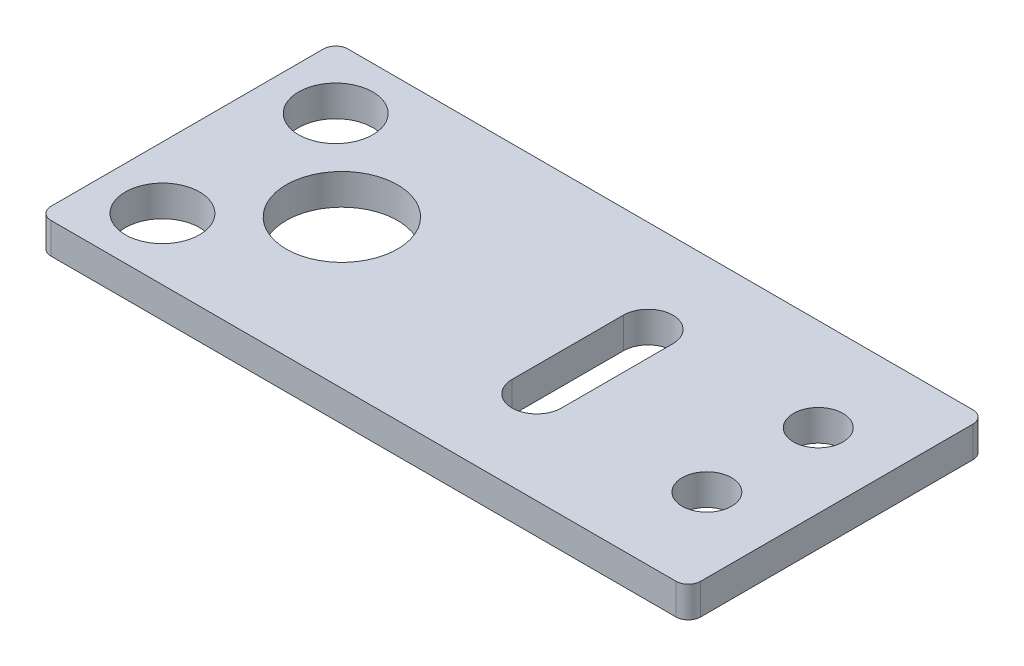
ISO-10303-21;
HEADER;
FILE_DESCRIPTION(('STEP AP214'),'2;1');
FILE_NAME('part.step','',(''),(''),'','','');
FILE_SCHEMA(('AUTOMOTIVE_DESIGN { 1 0 10303 214 1 1 1 1 }'));
ENDSEC;
DATA;
#1=APPLICATION_CONTEXT('core data for automotive mechanical design processes');
#2=APPLICATION_PROTOCOL_DEFINITION('international standard','automotive_design',2000,#1);
#3=PRODUCT_CONTEXT('',#1,'mechanical');
#4=PRODUCT('Part','Part','',(#3));
#5=PRODUCT_RELATED_PRODUCT_CATEGORY('part','',(#4));
#6=PRODUCT_DEFINITION_FORMATION('','',#4);
#7=PRODUCT_DEFINITION_CONTEXT('part definition',#1,'design');
#8=PRODUCT_DEFINITION('design','',#6,#7);
#9=PRODUCT_DEFINITION_SHAPE('','',#8);
#10=(LENGTH_UNIT() NAMED_UNIT(*) SI_UNIT(.MILLI.,.METRE.));
#11=(NAMED_UNIT(*) PLANE_ANGLE_UNIT() SI_UNIT($,.RADIAN.));
#12=(NAMED_UNIT(*) SI_UNIT($,.STERADIAN.) SOLID_ANGLE_UNIT());
#13=UNCERTAINTY_MEASURE_WITH_UNIT(LENGTH_MEASURE(1.E-05),#10,'distance_accuracy_value','');
#14=(GEOMETRIC_REPRESENTATION_CONTEXT(3) GLOBAL_UNCERTAINTY_ASSIGNED_CONTEXT((#13)) GLOBAL_UNIT_ASSIGNED_CONTEXT((#10,
#11,#12)) REPRESENTATION_CONTEXT('',''));
#15=CARTESIAN_POINT('',(0.,0.,0.));
#16=DIRECTION('',(0.,0.,1.));
#17=DIRECTION('',(1.,0.,0.));
#18=AXIS2_PLACEMENT_3D('',#15,#16,#17);
#19=CARTESIAN_POINT('',(0.,5.,0.));
#20=DIRECTION('',(0.,-1.,0.));
#21=DIRECTION('',(0.,0.,-1.));
#22=AXIS2_PLACEMENT_3D('',#19,#20,#21);
#23=PLANE('',#22);
#24=DIRECTION('',(0.,0.,-1.));
#25=VECTOR('',#24,1.);
#26=CARTESIAN_POINT('',(105.,5.,-48.));
#27=LINE('',#26,#25);
#28=CARTESIAN_POINT('',(105.,5.,-2.));
#29=VERTEX_POINT('',#28);
#30=CARTESIAN_POINT('',(105.,5.,-46.));
#31=VERTEX_POINT('',#30);
#32=EDGE_CURVE('E173',#29,#31,#27,.T.);
#33=ORIENTED_EDGE('',*,*,#32,.T.);
#34=CARTESIAN_POINT('',(103.,5.,-46.));
#35=DIRECTION('',(0.,-1.,0.));
#36=DIRECTION('',(0.,0.,-1.));
#37=AXIS2_PLACEMENT_3D('',#34,#35,#36);
#38=CIRCLE('',#37,2.);
#39=CARTESIAN_POINT('',(103.,5.,-48.));
#40=VERTEX_POINT('',#39);
#41=EDGE_CURVE('E211',#31,#40,#38,.F.);
#42=ORIENTED_EDGE('',*,*,#41,.T.);
#43=DIRECTION('',(-1.,0.,0.));
#44=VECTOR('',#43,1.);
#45=CARTESIAN_POINT('',(0.,5.,-48.));
#46=LINE('',#45,#44);
#47=CARTESIAN_POINT('',(2.,5.,-48.));
#48=VERTEX_POINT('',#47);
#49=EDGE_CURVE('E176',#40,#48,#46,.T.);
#50=ORIENTED_EDGE('',*,*,#49,.T.);
#51=CARTESIAN_POINT('',(2.,5.,-46.));
#52=DIRECTION('',(0.,-1.,0.));
#53=DIRECTION('',(0.,0.,-1.));
#54=AXIS2_PLACEMENT_3D('',#51,#52,#53);
#55=CIRCLE('',#54,2.);
#56=CARTESIAN_POINT('',(0.,5.,-46.));
#57=VERTEX_POINT('',#56);
#58=EDGE_CURVE('E206',#48,#57,#55,.F.);
#59=ORIENTED_EDGE('',*,*,#58,.T.);
#60=DIRECTION('',(0.,0.,1.));
#61=VECTOR('',#60,1.);
#62=CARTESIAN_POINT('',(0.,5.,0.));
#63=LINE('',#62,#61);
#64=CARTESIAN_POINT('',(0.,5.,-2.));
#65=VERTEX_POINT('',#64);
#66=EDGE_CURVE('E168',#57,#65,#63,.T.);
#67=ORIENTED_EDGE('',*,*,#66,.T.);
#68=CARTESIAN_POINT('',(2.,5.,-2.));
#69=DIRECTION('',(0.,-1.,0.));
#70=DIRECTION('',(0.,0.,-1.));
#71=AXIS2_PLACEMENT_3D('',#68,#69,#70);
#72=CIRCLE('',#71,2.);
#73=CARTESIAN_POINT('',(2.,5.,0.));
#74=VERTEX_POINT('',#73);
#75=EDGE_CURVE('E55',#65,#74,#72,.F.);
#76=ORIENTED_EDGE('',*,*,#75,.T.);
#77=DIRECTION('',(1.,0.,0.));
#78=VECTOR('',#77,1.);
#79=CARTESIAN_POINT('',(0.,5.,0.));
#80=LINE('',#79,#78);
#81=CARTESIAN_POINT('',(103.,5.,0.));
#82=VERTEX_POINT('',#81);
#83=EDGE_CURVE('E170',#74,#82,#80,.T.);
#84=ORIENTED_EDGE('',*,*,#83,.T.);
#85=CARTESIAN_POINT('',(103.,5.,-2.));
#86=DIRECTION('',(0.,-1.,0.));
#87=DIRECTION('',(0.,0.,-1.));
#88=AXIS2_PLACEMENT_3D('',#85,#86,#87);
#89=CIRCLE('',#88,2.);
#90=EDGE_CURVE('E209',#82,#29,#89,.F.);
#91=ORIENTED_EDGE('',*,*,#90,.T.);
#92=EDGE_LOOP('',(#33,#42,#50,#59,#67,#76,#84,#91));
#93=FACE_BOUND('',#92,.T.);
#94=CARTESIAN_POINT('',(65.5,5.,-33.));
#95=DIRECTION('',(0.,1.,0.));
#96=DIRECTION('',(0.,0.,1.));
#97=AXIS2_PLACEMENT_3D('',#94,#95,#96);
#98=CIRCLE('',#97,4.);
#99=CARTESIAN_POINT('',(69.5,5.,-33.));
#100=VERTEX_POINT('',#99);
#101=CARTESIAN_POINT('',(61.5,5.,-33.));
#102=VERTEX_POINT('',#101);
#103=EDGE_CURVE('E124',#100,#102,#98,.T.);
#104=ORIENTED_EDGE('',*,*,#103,.F.);
#105=DIRECTION('',(0.,0.,-1.));
#106=VECTOR('',#105,1.);
#107=CARTESIAN_POINT('',(69.5,5.,-33.));
#108=LINE('',#107,#106);
#109=CARTESIAN_POINT('',(69.5,5.,-15.));
#110=VERTEX_POINT('',#109);
#111=EDGE_CURVE('E150',#110,#100,#108,.T.);
#112=ORIENTED_EDGE('',*,*,#111,.F.);
#113=CARTESIAN_POINT('',(65.5,5.,-15.));
#114=DIRECTION('',(0.,1.,0.));
#115=DIRECTION('',(0.,0.,1.));
#116=AXIS2_PLACEMENT_3D('',#113,#114,#115);
#117=CIRCLE('',#116,4.);
#118=CARTESIAN_POINT('',(61.5,5.,-15.));
#119=VERTEX_POINT('',#118);
#120=EDGE_CURVE('E148',#119,#110,#117,.T.);
#121=ORIENTED_EDGE('',*,*,#120,.F.);
#122=DIRECTION('',(0.,0.,1.));
#123=VECTOR('',#122,1.);
#124=CARTESIAN_POINT('',(61.5,5.,-33.));
#125=LINE('',#124,#123);
#126=EDGE_CURVE('E134',#102,#119,#125,.T.);
#127=ORIENTED_EDGE('',*,*,#126,.F.);
#128=EDGE_LOOP('',(#104,#112,#121,#127));
#129=FACE_BOUND('',#128,.T.);
#130=CARTESIAN_POINT('',(10.,5.,-10.));
#131=DIRECTION('',(0.,1.,0.));
#132=DIRECTION('',(0.,0.,1.));
#133=AXIS2_PLACEMENT_3D('',#130,#131,#132);
#134=CIRCLE('',#133,6.);
#135=CARTESIAN_POINT('',(10.,5.,-4.));
#136=VERTEX_POINT('',#135);
#137=EDGE_CURVE('E157',#136,#136,#134,.T.);
#138=ORIENTED_EDGE('',*,*,#137,.F.);
#139=EDGE_LOOP('',(#138));
#140=FACE_BOUND('',#139,.T.);
#141=CARTESIAN_POINT('',(10.,5.,-38.));
#142=DIRECTION('',(0.,1.,0.));
#143=DIRECTION('',(0.,0.,1.));
#144=AXIS2_PLACEMENT_3D('',#141,#142,#143);
#145=CIRCLE('',#144,6.);
#146=CARTESIAN_POINT('',(10.,5.,-32.));
#147=VERTEX_POINT('',#146);
#148=EDGE_CURVE('E425',#147,#147,#145,.T.);
#149=ORIENTED_EDGE('',*,*,#148,.F.);
#150=EDGE_LOOP('',(#149));
#151=FACE_BOUND('',#150,.T.);
#152=CARTESIAN_POINT('',(25.,5.,-24.));
#153=DIRECTION('',(0.,1.,0.));
#154=DIRECTION('',(0.,0.,1.));
#155=AXIS2_PLACEMENT_3D('',#152,#153,#154);
#156=CIRCLE('',#155,9.);
#157=CARTESIAN_POINT('',(25.,5.,-15.));
#158=VERTEX_POINT('',#157);
#159=EDGE_CURVE('E432',#158,#158,#156,.T.);
#160=ORIENTED_EDGE('',*,*,#159,.F.);
#161=EDGE_LOOP('',(#160));
#162=FACE_BOUND('',#161,.T.);
#163=CARTESIAN_POINT('',(93.,5.,-15.));
#164=DIRECTION('',(0.,1.,0.));
#165=DIRECTION('',(0.,0.,1.));
#166=AXIS2_PLACEMENT_3D('',#163,#164,#165);
#167=CIRCLE('',#166,4.00000000000001);
#168=CARTESIAN_POINT('',(93.,5.,-11.));
#169=VERTEX_POINT('',#168);
#170=EDGE_CURVE('E437',#169,#169,#167,.T.);
#171=ORIENTED_EDGE('',*,*,#170,.F.);
#172=EDGE_LOOP('',(#171));
#173=FACE_BOUND('',#172,.T.);
#174=CARTESIAN_POINT('',(93.,5.,-33.));
#175=DIRECTION('',(0.,1.,0.));
#176=DIRECTION('',(0.,0.,1.));
#177=AXIS2_PLACEMENT_3D('',#174,#175,#176);
#178=CIRCLE('',#177,4.00000000000001);
#179=CARTESIAN_POINT('',(93.,5.,-29.));
#180=VERTEX_POINT('',#179);
#181=EDGE_CURVE('E443',#180,#180,#178,.T.);
#182=ORIENTED_EDGE('',*,*,#181,.F.);
#183=EDGE_LOOP('',(#182));
#184=FACE_BOUND('',#183,.T.);
#185=ADVANCED_FACE('F33',(#93,#129,#140,#151,#162,#173,#184),#23,.F.);
#186=CARTESIAN_POINT('',(0.,0.,0.));
#187=DIRECTION('',(0.,-1.,0.));
#188=DIRECTION('',(0.,0.,-1.));
#189=AXIS2_PLACEMENT_3D('',#186,#187,#188);
#190=PLANE('',#189);
#191=CARTESIAN_POINT('',(93.,0.,-15.));
#192=DIRECTION('',(0.,1.,0.));
#193=DIRECTION('',(0.,0.,1.));
#194=AXIS2_PLACEMENT_3D('',#191,#192,#193);
#195=CIRCLE('',#194,4.00000000000001);
#196=CARTESIAN_POINT('',(93.,0.,-11.));
#197=VERTEX_POINT('',#196);
#198=EDGE_CURVE('E440',#197,#197,#195,.T.);
#199=ORIENTED_EDGE('',*,*,#198,.T.);
#200=EDGE_LOOP('',(#199));
#201=FACE_BOUND('',#200,.T.);
#202=CARTESIAN_POINT('',(10.,0.,-38.));
#203=DIRECTION('',(0.,1.,0.));
#204=DIRECTION('',(0.,0.,1.));
#205=AXIS2_PLACEMENT_3D('',#202,#203,#204);
#206=CIRCLE('',#205,6.);
#207=CARTESIAN_POINT('',(10.,0.,-32.));
#208=VERTEX_POINT('',#207);
#209=EDGE_CURVE('E428',#208,#208,#206,.T.);
#210=ORIENTED_EDGE('',*,*,#209,.T.);
#211=EDGE_LOOP('',(#210));
#212=FACE_BOUND('',#211,.T.);
#213=DIRECTION('',(0.,0.,-1.));
#214=VECTOR('',#213,1.);
#215=CARTESIAN_POINT('',(69.5,0.,-33.));
#216=LINE('',#215,#214);
#217=CARTESIAN_POINT('',(69.5,0.,-15.));
#218=VERTEX_POINT('',#217);
#219=CARTESIAN_POINT('',(69.5,0.,-33.));
#220=VERTEX_POINT('',#219);
#221=EDGE_CURVE('E135',#218,#220,#216,.T.);
#222=ORIENTED_EDGE('',*,*,#221,.T.);
#223=CARTESIAN_POINT('',(65.5,0.,-33.));
#224=DIRECTION('',(0.,1.,0.));
#225=DIRECTION('',(0.,0.,1.));
#226=AXIS2_PLACEMENT_3D('',#223,#224,#225);
#227=CIRCLE('',#226,4.);
#228=CARTESIAN_POINT('',(61.5,0.,-33.));
#229=VERTEX_POINT('',#228);
#230=EDGE_CURVE('E155',#220,#229,#227,.T.);
#231=ORIENTED_EDGE('',*,*,#230,.T.);
#232=DIRECTION('',(0.,0.,1.));
#233=VECTOR('',#232,1.);
#234=CARTESIAN_POINT('',(61.5,0.,-33.));
#235=LINE('',#234,#233);
#236=CARTESIAN_POINT('',(61.5,0.,-15.));
#237=VERTEX_POINT('',#236);
#238=EDGE_CURVE('E141',#229,#237,#235,.T.);
#239=ORIENTED_EDGE('',*,*,#238,.T.);
#240=CARTESIAN_POINT('',(65.5,0.,-15.));
#241=DIRECTION('',(0.,1.,0.));
#242=DIRECTION('',(0.,0.,1.));
#243=AXIS2_PLACEMENT_3D('',#240,#241,#242);
#244=CIRCLE('',#243,4.);
#245=EDGE_CURVE('E159',#237,#218,#244,.T.);
#246=ORIENTED_EDGE('',*,*,#245,.T.);
#247=EDGE_LOOP('',(#222,#231,#239,#246));
#248=FACE_BOUND('',#247,.T.);
#249=DIRECTION('',(-1.,0.,0.));
#250=VECTOR('',#249,1.);
#251=CARTESIAN_POINT('',(0.,0.,-48.));
#252=LINE('',#251,#250);
#253=CARTESIAN_POINT('',(103.,0.,-48.));
#254=VERTEX_POINT('',#253);
#255=CARTESIAN_POINT('',(2.,0.,-48.));
#256=VERTEX_POINT('',#255);
#257=EDGE_CURVE('E171',#254,#256,#252,.T.);
#258=ORIENTED_EDGE('',*,*,#257,.F.);
#259=CARTESIAN_POINT('',(103.,0.,-46.));
#260=DIRECTION('',(0.,-1.,0.));
#261=DIRECTION('',(0.,0.,-1.));
#262=AXIS2_PLACEMENT_3D('',#259,#260,#261);
#263=CIRCLE('',#262,2.);
#264=CARTESIAN_POINT('',(105.,0.,-46.));
#265=VERTEX_POINT('',#264);
#266=EDGE_CURVE('E199',#254,#265,#263,.T.);
#267=ORIENTED_EDGE('',*,*,#266,.T.);
#268=DIRECTION('',(0.,0.,-1.));
#269=VECTOR('',#268,1.);
#270=CARTESIAN_POINT('',(105.,0.,-48.));
#271=LINE('',#270,#269);
#272=CARTESIAN_POINT('',(105.,0.,-2.));
#273=VERTEX_POINT('',#272);
#274=EDGE_CURVE('E184',#273,#265,#271,.T.);
#275=ORIENTED_EDGE('',*,*,#274,.F.);
#276=CARTESIAN_POINT('',(103.,0.,-2.));
#277=DIRECTION('',(0.,-1.,0.));
#278=DIRECTION('',(0.,0.,-1.));
#279=AXIS2_PLACEMENT_3D('',#276,#277,#278);
#280=CIRCLE('',#279,2.);
#281=CARTESIAN_POINT('',(103.,0.,0.));
#282=VERTEX_POINT('',#281);
#283=EDGE_CURVE('E197',#273,#282,#280,.T.);
#284=ORIENTED_EDGE('',*,*,#283,.T.);
#285=DIRECTION('',(1.,0.,0.));
#286=VECTOR('',#285,1.);
#287=CARTESIAN_POINT('',(0.,0.,0.));
#288=LINE('',#287,#286);
#289=CARTESIAN_POINT('',(2.,0.,0.));
#290=VERTEX_POINT('',#289);
#291=EDGE_CURVE('E182',#290,#282,#288,.T.);
#292=ORIENTED_EDGE('',*,*,#291,.F.);
#293=CARTESIAN_POINT('',(2.,0.,-2.));
#294=DIRECTION('',(0.,-1.,0.));
#295=DIRECTION('',(0.,0.,-1.));
#296=AXIS2_PLACEMENT_3D('',#293,#294,#295);
#297=CIRCLE('',#296,2.);
#298=CARTESIAN_POINT('',(0.,0.,-2.));
#299=VERTEX_POINT('',#298);
#300=EDGE_CURVE('E195',#290,#299,#297,.T.);
#301=ORIENTED_EDGE('',*,*,#300,.T.);
#302=DIRECTION('',(0.,0.,1.));
#303=VECTOR('',#302,1.);
#304=CARTESIAN_POINT('',(0.,0.,0.));
#305=LINE('',#304,#303);
#306=CARTESIAN_POINT('',(0.,0.,-46.));
#307=VERTEX_POINT('',#306);
#308=EDGE_CURVE('E142',#307,#299,#305,.T.);
#309=ORIENTED_EDGE('',*,*,#308,.F.);
#310=CARTESIAN_POINT('',(2.,0.,-46.));
#311=DIRECTION('',(0.,-1.,0.));
#312=DIRECTION('',(0.,0.,-1.));
#313=AXIS2_PLACEMENT_3D('',#310,#311,#312);
#314=CIRCLE('',#313,2.);
#315=EDGE_CURVE('E193',#307,#256,#314,.T.);
#316=ORIENTED_EDGE('',*,*,#315,.T.);
#317=EDGE_LOOP('',(#258,#267,#275,#284,#292,#301,#309,#316));
#318=FACE_BOUND('',#317,.T.);
#319=CARTESIAN_POINT('',(10.,0.,-10.));
#320=DIRECTION('',(0.,1.,0.));
#321=DIRECTION('',(0.,0.,1.));
#322=AXIS2_PLACEMENT_3D('',#319,#320,#321);
#323=CIRCLE('',#322,6.);
#324=CARTESIAN_POINT('',(10.,0.,-4.));
#325=VERTEX_POINT('',#324);
#326=EDGE_CURVE('E424',#325,#325,#323,.T.);
#327=ORIENTED_EDGE('',*,*,#326,.T.);
#328=EDGE_LOOP('',(#327));
#329=FACE_BOUND('',#328,.T.);
#330=CARTESIAN_POINT('',(25.,0.,-24.));
#331=DIRECTION('',(0.,1.,0.));
#332=DIRECTION('',(0.,0.,1.));
#333=AXIS2_PLACEMENT_3D('',#330,#331,#332);
#334=CIRCLE('',#333,9.);
#335=CARTESIAN_POINT('',(25.,0.,-15.));
#336=VERTEX_POINT('',#335);
#337=EDGE_CURVE('E434',#336,#336,#334,.T.);
#338=ORIENTED_EDGE('',*,*,#337,.T.);
#339=EDGE_LOOP('',(#338));
#340=FACE_BOUND('',#339,.T.);
#341=CARTESIAN_POINT('',(93.,0.,-33.));
#342=DIRECTION('',(0.,1.,0.));
#343=DIRECTION('',(0.,0.,1.));
#344=AXIS2_PLACEMENT_3D('',#341,#342,#343);
#345=CIRCLE('',#344,4.00000000000001);
#346=CARTESIAN_POINT('',(93.,0.,-29.));
#347=VERTEX_POINT('',#346);
#348=EDGE_CURVE('E446',#347,#347,#345,.T.);
#349=ORIENTED_EDGE('',*,*,#348,.T.);
#350=EDGE_LOOP('',(#349));
#351=FACE_BOUND('',#350,.T.);
#352=ADVANCED_FACE('F227',(#201,#212,#248,#318,#329,#340,#351),#190,.T.);
#353=CARTESIAN_POINT('',(0.,5.,0.));
#354=DIRECTION('',(1.,0.,0.));
#355=DIRECTION('',(0.,0.,-1.));
#356=AXIS2_PLACEMENT_3D('',#353,#354,#355);
#357=PLANE('',#356);
#358=ORIENTED_EDGE('',*,*,#308,.T.);
#359=DIRECTION('',(0.,-1.,0.));
#360=VECTOR('',#359,1.);
#361=CARTESIAN_POINT('',(0.,5.,-2.));
#362=LINE('',#361,#360);
#363=EDGE_CURVE('E11',#299,#65,#362,.F.);
#364=ORIENTED_EDGE('',*,*,#363,.T.);
#365=ORIENTED_EDGE('',*,*,#66,.F.);
#366=DIRECTION('',(0.,-1.,0.));
#367=VECTOR('',#366,1.);
#368=CARTESIAN_POINT('',(0.,5.,-46.));
#369=LINE('',#368,#367);
#370=EDGE_CURVE('E41',#57,#307,#369,.T.);
#371=ORIENTED_EDGE('',*,*,#370,.T.);
#372=EDGE_LOOP('',(#358,#364,#365,#371));
#373=FACE_BOUND('',#372,.T.);
#374=ADVANCED_FACE('F221',(#373),#357,.F.);
#375=CARTESIAN_POINT('',(0.,5.,0.));
#376=DIRECTION('',(0.,0.,-1.));
#377=DIRECTION('',(-1.,0.,0.));
#378=AXIS2_PLACEMENT_3D('',#375,#376,#377);
#379=PLANE('',#378);
#380=ORIENTED_EDGE('',*,*,#291,.T.);
#381=DIRECTION('',(0.,-1.,0.));
#382=VECTOR('',#381,1.);
#383=CARTESIAN_POINT('',(103.,5.,0.));
#384=LINE('',#383,#382);
#385=EDGE_CURVE('E48',#282,#82,#384,.F.);
#386=ORIENTED_EDGE('',*,*,#385,.T.);
#387=ORIENTED_EDGE('',*,*,#83,.F.);
#388=DIRECTION('',(0.,-1.,0.));
#389=VECTOR('',#388,1.);
#390=CARTESIAN_POINT('',(2.,5.,0.));
#391=LINE('',#390,#389);
#392=EDGE_CURVE('E213',#74,#290,#391,.T.);
#393=ORIENTED_EDGE('',*,*,#392,.T.);
#394=EDGE_LOOP('',(#380,#386,#387,#393));
#395=FACE_BOUND('',#394,.T.);
#396=ADVANCED_FACE('F233',(#395),#379,.F.);
#397=CARTESIAN_POINT('',(105.,5.,-48.));
#398=DIRECTION('',(-1.,0.,0.));
#399=DIRECTION('',(0.,0.,1.));
#400=AXIS2_PLACEMENT_3D('',#397,#398,#399);
#401=PLANE('',#400);
#402=ORIENTED_EDGE('',*,*,#274,.T.);
#403=DIRECTION('',(0.,-1.,0.));
#404=VECTOR('',#403,1.);
#405=CARTESIAN_POINT('',(105.,5.,-46.));
#406=LINE('',#405,#404);
#407=EDGE_CURVE('E204',#265,#31,#406,.F.);
#408=ORIENTED_EDGE('',*,*,#407,.T.);
#409=ORIENTED_EDGE('',*,*,#32,.F.);
#410=DIRECTION('',(0.,-1.,0.));
#411=VECTOR('',#410,1.);
#412=CARTESIAN_POINT('',(105.,5.,-2.));
#413=LINE('',#412,#411);
#414=EDGE_CURVE('E201',#29,#273,#413,.T.);
#415=ORIENTED_EDGE('',*,*,#414,.T.);
#416=EDGE_LOOP('',(#402,#408,#409,#415));
#417=FACE_BOUND('',#416,.T.);
#418=ADVANCED_FACE('F241',(#417),#401,.F.);
#419=CARTESIAN_POINT('',(0.,5.,-48.));
#420=DIRECTION('',(0.,0.,1.));
#421=DIRECTION('',(1.,0.,0.));
#422=AXIS2_PLACEMENT_3D('',#419,#420,#421);
#423=PLANE('',#422);
#424=ORIENTED_EDGE('',*,*,#49,.F.);
#425=DIRECTION('',(0.,-1.,0.));
#426=VECTOR('',#425,1.);
#427=CARTESIAN_POINT('',(103.,5.,-48.));
#428=LINE('',#427,#426);
#429=EDGE_CURVE('E190',#40,#254,#428,.T.);
#430=ORIENTED_EDGE('',*,*,#429,.T.);
#431=ORIENTED_EDGE('',*,*,#257,.T.);
#432=DIRECTION('',(0.,-1.,0.));
#433=VECTOR('',#432,1.);
#434=CARTESIAN_POINT('',(2.,5.,-48.));
#435=LINE('',#434,#433);
#436=EDGE_CURVE('E179',#256,#48,#435,.F.);
#437=ORIENTED_EDGE('',*,*,#436,.T.);
#438=EDGE_LOOP('',(#424,#430,#431,#437));
#439=FACE_BOUND('',#438,.T.);
#440=ADVANCED_FACE('F249',(#439),#423,.F.);
#441=CARTESIAN_POINT('',(65.5,5.,-33.));
#442=DIRECTION('',(0.,-1.,0.));
#443=DIRECTION('',(0.,0.,-1.));
#444=AXIS2_PLACEMENT_3D('',#441,#442,#443);
#445=CYLINDRICAL_SURFACE('',#444,4.);
#446=ORIENTED_EDGE('',*,*,#230,.F.);
#447=DIRECTION('',(0.,-1.,0.));
#448=VECTOR('',#447,1.);
#449=CARTESIAN_POINT('',(69.5,5.,-33.));
#450=LINE('',#449,#448);
#451=EDGE_CURVE('E130',#100,#220,#450,.T.);
#452=ORIENTED_EDGE('',*,*,#451,.F.);
#453=ORIENTED_EDGE('',*,*,#103,.T.);
#454=DIRECTION('',(0.,-1.,0.));
#455=VECTOR('',#454,1.);
#456=CARTESIAN_POINT('',(61.5,5.,-33.));
#457=LINE('',#456,#455);
#458=EDGE_CURVE('E127',#102,#229,#457,.T.);
#459=ORIENTED_EDGE('',*,*,#458,.T.);
#460=EDGE_LOOP('',(#446,#452,#453,#459));
#461=FACE_BOUND('',#460,.T.);
#462=ADVANCED_FACE('F126',(#461),#445,.F.);
#463=CARTESIAN_POINT('',(61.5,5.,-33.));
#464=DIRECTION('',(1.,0.,0.));
#465=DIRECTION('',(0.,0.,-1.));
#466=AXIS2_PLACEMENT_3D('',#463,#464,#465);
#467=PLANE('',#466);
#468=ORIENTED_EDGE('',*,*,#238,.F.);
#469=ORIENTED_EDGE('',*,*,#458,.F.);
#470=ORIENTED_EDGE('',*,*,#126,.T.);
#471=DIRECTION('',(0.,-1.,0.));
#472=VECTOR('',#471,1.);
#473=CARTESIAN_POINT('',(61.5,5.,-15.));
#474=LINE('',#473,#472);
#475=EDGE_CURVE('E143',#119,#237,#474,.T.);
#476=ORIENTED_EDGE('',*,*,#475,.T.);
#477=EDGE_LOOP('',(#468,#469,#470,#476));
#478=FACE_BOUND('',#477,.T.);
#479=ADVANCED_FACE('F138',(#478),#467,.T.);
#480=CARTESIAN_POINT('',(65.5,5.,-15.));
#481=DIRECTION('',(0.,-1.,0.));
#482=DIRECTION('',(0.,0.,-1.));
#483=AXIS2_PLACEMENT_3D('',#480,#481,#482);
#484=CYLINDRICAL_SURFACE('',#483,4.);
#485=ORIENTED_EDGE('',*,*,#245,.F.);
#486=ORIENTED_EDGE('',*,*,#475,.F.);
#487=ORIENTED_EDGE('',*,*,#120,.T.);
#488=DIRECTION('',(0.,-1.,0.));
#489=VECTOR('',#488,1.);
#490=CARTESIAN_POINT('',(69.5,5.,-15.));
#491=LINE('',#490,#489);
#492=EDGE_CURVE('E165',#110,#218,#491,.T.);
#493=ORIENTED_EDGE('',*,*,#492,.T.);
#494=EDGE_LOOP('',(#485,#486,#487,#493));
#495=FACE_BOUND('',#494,.T.);
#496=ADVANCED_FACE('F351',(#495),#484,.F.);
#497=CARTESIAN_POINT('',(69.5,5.,-33.));
#498=DIRECTION('',(-1.,0.,0.));
#499=DIRECTION('',(0.,0.,1.));
#500=AXIS2_PLACEMENT_3D('',#497,#498,#499);
#501=PLANE('',#500);
#502=ORIENTED_EDGE('',*,*,#221,.F.);
#503=ORIENTED_EDGE('',*,*,#492,.F.);
#504=ORIENTED_EDGE('',*,*,#111,.T.);
#505=ORIENTED_EDGE('',*,*,#451,.T.);
#506=EDGE_LOOP('',(#502,#503,#504,#505));
#507=FACE_BOUND('',#506,.T.);
#508=ADVANCED_FACE('F342',(#507),#501,.T.);
#509=CARTESIAN_POINT('',(10.,5.,-10.));
#510=DIRECTION('',(0.,-1.,0.));
#511=DIRECTION('',(0.,0.,-1.));
#512=AXIS2_PLACEMENT_3D('',#509,#510,#511);
#513=CYLINDRICAL_SURFACE('',#512,6.);
#514=ORIENTED_EDGE('',*,*,#137,.T.);
#515=EDGE_LOOP('',(#514));
#516=FACE_BOUND('',#515,.T.);
#517=ORIENTED_EDGE('',*,*,#326,.F.);
#518=EDGE_LOOP('',(#517));
#519=FACE_BOUND('',#518,.T.);
#520=ADVANCED_FACE('F333',(#516,#519),#513,.F.);
#521=CARTESIAN_POINT('',(10.,5.,-38.));
#522=DIRECTION('',(0.,-1.,0.));
#523=DIRECTION('',(0.,0.,-1.));
#524=AXIS2_PLACEMENT_3D('',#521,#522,#523);
#525=CYLINDRICAL_SURFACE('',#524,6.);
#526=ORIENTED_EDGE('',*,*,#148,.T.);
#527=EDGE_LOOP('',(#526));
#528=FACE_BOUND('',#527,.T.);
#529=ORIENTED_EDGE('',*,*,#209,.F.);
#530=EDGE_LOOP('',(#529));
#531=FACE_BOUND('',#530,.T.);
#532=ADVANCED_FACE('F324',(#528,#531),#525,.F.);
#533=CARTESIAN_POINT('',(25.,5.,-24.));
#534=DIRECTION('',(0.,-1.,0.));
#535=DIRECTION('',(0.,0.,-1.));
#536=AXIS2_PLACEMENT_3D('',#533,#534,#535);
#537=CYLINDRICAL_SURFACE('',#536,9.);
#538=ORIENTED_EDGE('',*,*,#159,.T.);
#539=EDGE_LOOP('',(#538));
#540=FACE_BOUND('',#539,.T.);
#541=ORIENTED_EDGE('',*,*,#337,.F.);
#542=EDGE_LOOP('',(#541));
#543=FACE_BOUND('',#542,.T.);
#544=ADVANCED_FACE('F315',(#540,#543),#537,.F.);
#545=CARTESIAN_POINT('',(93.,5.,-15.));
#546=DIRECTION('',(0.,-1.,0.));
#547=DIRECTION('',(0.,0.,-1.));
#548=AXIS2_PLACEMENT_3D('',#545,#546,#547);
#549=CYLINDRICAL_SURFACE('',#548,4.00000000000001);
#550=ORIENTED_EDGE('',*,*,#170,.T.);
#551=EDGE_LOOP('',(#550));
#552=FACE_BOUND('',#551,.T.);
#553=ORIENTED_EDGE('',*,*,#198,.F.);
#554=EDGE_LOOP('',(#553));
#555=FACE_BOUND('',#554,.T.);
#556=ADVANCED_FACE('F306',(#552,#555),#549,.F.);
#557=CARTESIAN_POINT('',(93.,5.,-33.));
#558=DIRECTION('',(0.,-1.,0.));
#559=DIRECTION('',(0.,0.,-1.));
#560=AXIS2_PLACEMENT_3D('',#557,#558,#559);
#561=CYLINDRICAL_SURFACE('',#560,4.00000000000001);
#562=ORIENTED_EDGE('',*,*,#181,.T.);
#563=EDGE_LOOP('',(#562));
#564=FACE_BOUND('',#563,.T.);
#565=ORIENTED_EDGE('',*,*,#348,.F.);
#566=EDGE_LOOP('',(#565));
#567=FACE_BOUND('',#566,.T.);
#568=ADVANCED_FACE('F275',(#564,#567),#561,.F.);
#569=CARTESIAN_POINT('',(103.,5.,-46.));
#570=DIRECTION('',(0.,-1.,0.));
#571=DIRECTION('',(0.,0.,-1.));
#572=AXIS2_PLACEMENT_3D('',#569,#570,#571);
#573=CYLINDRICAL_SURFACE('',#572,2.);
#574=ORIENTED_EDGE('',*,*,#41,.F.);
#575=ORIENTED_EDGE('',*,*,#407,.F.);
#576=ORIENTED_EDGE('',*,*,#266,.F.);
#577=ORIENTED_EDGE('',*,*,#429,.F.);
#578=EDGE_LOOP('',(#574,#575,#576,#577));
#579=FACE_BOUND('',#578,.T.);
#580=ADVANCED_FACE('F246',(#579),#573,.T.);
#581=CARTESIAN_POINT('',(103.,5.,-2.));
#582=DIRECTION('',(0.,-1.,0.));
#583=DIRECTION('',(0.,0.,-1.));
#584=AXIS2_PLACEMENT_3D('',#581,#582,#583);
#585=CYLINDRICAL_SURFACE('',#584,2.);
#586=ORIENTED_EDGE('',*,*,#90,.F.);
#587=ORIENTED_EDGE('',*,*,#385,.F.);
#588=ORIENTED_EDGE('',*,*,#283,.F.);
#589=ORIENTED_EDGE('',*,*,#414,.F.);
#590=EDGE_LOOP('',(#586,#587,#588,#589));
#591=FACE_BOUND('',#590,.T.);
#592=ADVANCED_FACE('F238',(#591),#585,.T.);
#593=CARTESIAN_POINT('',(2.,5.,-2.));
#594=DIRECTION('',(0.,-1.,0.));
#595=DIRECTION('',(0.,0.,-1.));
#596=AXIS2_PLACEMENT_3D('',#593,#594,#595);
#597=CYLINDRICAL_SURFACE('',#596,2.);
#598=ORIENTED_EDGE('',*,*,#75,.F.);
#599=ORIENTED_EDGE('',*,*,#363,.F.);
#600=ORIENTED_EDGE('',*,*,#300,.F.);
#601=ORIENTED_EDGE('',*,*,#392,.F.);
#602=EDGE_LOOP('',(#598,#599,#600,#601));
#603=FACE_BOUND('',#602,.T.);
#604=ADVANCED_FACE('F232',(#603),#597,.T.);
#605=CARTESIAN_POINT('',(2.,5.,-46.));
#606=DIRECTION('',(0.,-1.,0.));
#607=DIRECTION('',(0.,0.,-1.));
#608=AXIS2_PLACEMENT_3D('',#605,#606,#607);
#609=CYLINDRICAL_SURFACE('',#608,2.);
#610=ORIENTED_EDGE('',*,*,#58,.F.);
#611=ORIENTED_EDGE('',*,*,#436,.F.);
#612=ORIENTED_EDGE('',*,*,#315,.F.);
#613=ORIENTED_EDGE('',*,*,#370,.F.);
#614=EDGE_LOOP('',(#610,#611,#612,#613));
#615=FACE_BOUND('',#614,.T.);
#616=ADVANCED_FACE('F35',(#615),#609,.T.);
#617=CLOSED_SHELL('',(#185,#352,#374,#396,#418,#440,#462,#479,#496,#508,#520,#532,#544,#556,
#568,#580,#592,#604,#616));
#618=MANIFOLD_SOLID_BREP('B2',#617);
#619=ADVANCED_BREP_SHAPE_REPRESENTATION('',(#18,#618),#14);
#620=SHAPE_DEFINITION_REPRESENTATION(#9,#619);
ENDSEC;
END-ISO-10303-21;
